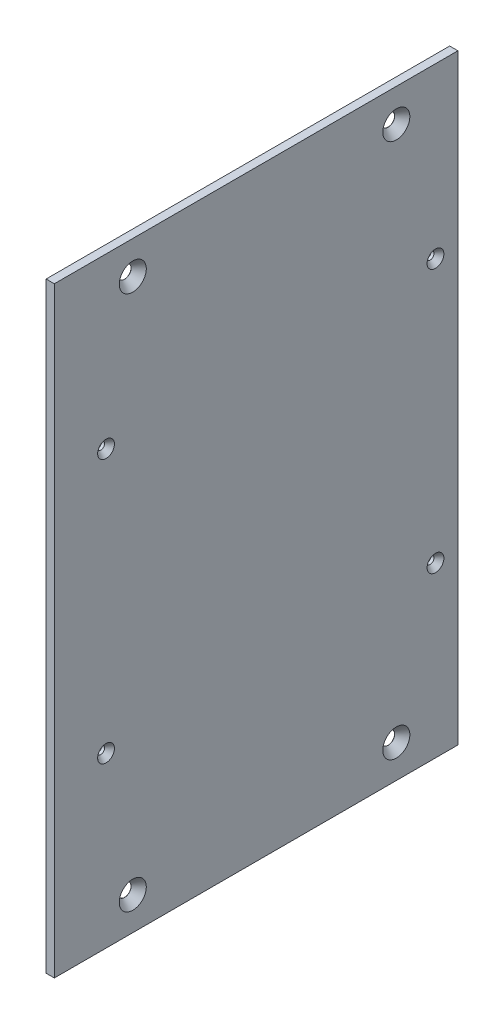
ISO-10303-21;
HEADER;
FILE_DESCRIPTION(('STEP AP214'),'2;1');
FILE_NAME('part.step','',(''),(''),'','','');
FILE_SCHEMA(('AUTOMOTIVE_DESIGN { 1 0 10303 214 1 1 1 1 }'));
ENDSEC;
DATA;
#1=APPLICATION_CONTEXT('core data for automotive mechanical design processes');
#2=APPLICATION_PROTOCOL_DEFINITION('international standard','automotive_design',2000,#1);
#3=PRODUCT_CONTEXT('',#1,'mechanical');
#4=PRODUCT('Part','Part','',(#3));
#5=PRODUCT_RELATED_PRODUCT_CATEGORY('part','',(#4));
#6=PRODUCT_DEFINITION_FORMATION('','',#4);
#7=PRODUCT_DEFINITION_CONTEXT('part definition',#1,'design');
#8=PRODUCT_DEFINITION('design','',#6,#7);
#9=PRODUCT_DEFINITION_SHAPE('','',#8);
#10=(LENGTH_UNIT() NAMED_UNIT(*) SI_UNIT(.MILLI.,.METRE.));
#11=(NAMED_UNIT(*) PLANE_ANGLE_UNIT() SI_UNIT($,.RADIAN.));
#12=(NAMED_UNIT(*) SI_UNIT($,.STERADIAN.) SOLID_ANGLE_UNIT());
#13=UNCERTAINTY_MEASURE_WITH_UNIT(LENGTH_MEASURE(1.E-05),#10,'distance_accuracy_value','');
#14=(GEOMETRIC_REPRESENTATION_CONTEXT(3) GLOBAL_UNCERTAINTY_ASSIGNED_CONTEXT((#13)) GLOBAL_UNIT_ASSIGNED_CONTEXT((#10,
#11,#12)) REPRESENTATION_CONTEXT('',''));
#15=CARTESIAN_POINT('',(0.,0.,0.));
#16=DIRECTION('',(0.,0.,1.));
#17=DIRECTION('',(1.,0.,0.));
#18=AXIS2_PLACEMENT_3D('',#15,#16,#17);
#19=CARTESIAN_POINT('',(22.225,24.3094717648979,25.2650178388084));
#20=DIRECTION('',(0.,-1.,0.));
#21=DIRECTION('',(1.,0.,0.));
#22=AXIS2_PLACEMENT_3D('',#19,#20,#21);
#23=PLANE('',#22);
#24=DIRECTION('',(0.,0.,1.));
#25=VECTOR('',#24,1.);
#26=CARTESIAN_POINT('',(19.05,24.3094717648979,25.2650178388084));
#27=LINE('',#26,#25);
#28=CARTESIAN_POINT('',(19.05,24.3094717648979,25.2650178388084));
#29=VERTEX_POINT('',#28);
#30=CARTESIAN_POINT('',(19.05,24.3094717648979,180.840017838808));
#31=VERTEX_POINT('',#30);
#32=EDGE_CURVE('E111',#29,#31,#27,.T.);
#33=ORIENTED_EDGE('',*,*,#32,.T.);
#34=DIRECTION('',(-1.,0.,0.));
#35=VECTOR('',#34,1.);
#36=CARTESIAN_POINT('',(22.225,24.3094717648979,180.840017838808));
#37=LINE('',#36,#35);
#38=CARTESIAN_POINT('',(22.225,24.3094717648979,180.840017838808));
#39=VERTEX_POINT('',#38);
#40=EDGE_CURVE('E11',#39,#31,#37,.T.);
#41=ORIENTED_EDGE('',*,*,#40,.F.);
#42=DIRECTION('',(0.,0.,1.));
#43=VECTOR('',#42,1.);
#44=CARTESIAN_POINT('',(22.225,24.3094717648979,25.2650178388084));
#45=LINE('',#44,#43);
#46=CARTESIAN_POINT('',(22.225,24.3094717648979,25.2650178388084));
#47=VERTEX_POINT('',#46);
#48=EDGE_CURVE('E95',#47,#39,#45,.T.);
#49=ORIENTED_EDGE('',*,*,#48,.F.);
#50=DIRECTION('',(-1.,0.,0.));
#51=VECTOR('',#50,1.);
#52=CARTESIAN_POINT('',(22.225,24.3094717648979,25.2650178388084));
#53=LINE('',#52,#51);
#54=EDGE_CURVE('E107',#47,#29,#53,.T.);
#55=ORIENTED_EDGE('',*,*,#54,.T.);
#56=EDGE_LOOP('',(#33,#41,#49,#55));
#57=FACE_BOUND('',#56,.T.);
#58=ADVANCED_FACE('F43',(#57),#23,.F.);
#59=CARTESIAN_POINT('',(22.225,24.3094717648979,180.840017838808));
#60=DIRECTION('',(0.,0.,-1.));
#61=DIRECTION('',(-1.,0.,0.));
#62=AXIS2_PLACEMENT_3D('',#59,#60,#61);
#63=PLANE('',#62);
#64=DIRECTION('',(0.,-1.,0.));
#65=VECTOR('',#64,1.);
#66=CARTESIAN_POINT('',(19.05,24.3094717648979,180.840017838808));
#67=LINE('',#66,#65);
#68=CARTESIAN_POINT('',(19.05,-207.465528738518,180.840017838808));
#69=VERTEX_POINT('',#68);
#70=EDGE_CURVE('E100',#31,#69,#67,.T.);
#71=ORIENTED_EDGE('',*,*,#70,.T.);
#72=DIRECTION('',(-1.,0.,0.));
#73=VECTOR('',#72,1.);
#74=CARTESIAN_POINT('',(22.225,-207.465528738518,180.840017838808));
#75=LINE('',#74,#73);
#76=CARTESIAN_POINT('',(22.225,-207.465528738518,180.840017838808));
#77=VERTEX_POINT('',#76);
#78=EDGE_CURVE('E52',#77,#69,#75,.T.);
#79=ORIENTED_EDGE('',*,*,#78,.F.);
#80=DIRECTION('',(0.,-1.,0.));
#81=VECTOR('',#80,1.);
#82=CARTESIAN_POINT('',(22.225,24.3094717648979,180.840017838808));
#83=LINE('',#82,#81);
#84=EDGE_CURVE('E90',#39,#77,#83,.T.);
#85=ORIENTED_EDGE('',*,*,#84,.F.);
#86=ORIENTED_EDGE('',*,*,#40,.T.);
#87=EDGE_LOOP('',(#71,#79,#85,#86));
#88=FACE_BOUND('',#87,.T.);
#89=ADVANCED_FACE('F99',(#88),#63,.F.);
#90=CARTESIAN_POINT('',(22.225,-207.465528738518,180.840017838808));
#91=DIRECTION('',(0.,1.,0.));
#92=DIRECTION('',(0.,0.,1.));
#93=AXIS2_PLACEMENT_3D('',#90,#91,#92);
#94=PLANE('',#93);
#95=DIRECTION('',(0.,0.,-1.));
#96=VECTOR('',#95,1.);
#97=CARTESIAN_POINT('',(19.05,-207.465528738518,180.840017838808));
#98=LINE('',#97,#96);
#99=CARTESIAN_POINT('',(19.05,-207.465528738517,25.2650178388084));
#100=VERTEX_POINT('',#99);
#101=EDGE_CURVE('E77',#69,#100,#98,.T.);
#102=ORIENTED_EDGE('',*,*,#101,.T.);
#103=DIRECTION('',(-1.,0.,0.));
#104=VECTOR('',#103,1.);
#105=CARTESIAN_POINT('',(22.225,-207.465528738517,25.2650178388084));
#106=LINE('',#105,#104);
#107=CARTESIAN_POINT('',(22.225,-207.465528738517,25.2650178388084));
#108=VERTEX_POINT('',#107);
#109=EDGE_CURVE('E102',#108,#100,#106,.T.);
#110=ORIENTED_EDGE('',*,*,#109,.F.);
#111=DIRECTION('',(0.,0.,-1.));
#112=VECTOR('',#111,1.);
#113=CARTESIAN_POINT('',(22.225,-207.465528738518,180.840017838808));
#114=LINE('',#113,#112);
#115=EDGE_CURVE('E93',#77,#108,#114,.T.);
#116=ORIENTED_EDGE('',*,*,#115,.F.);
#117=ORIENTED_EDGE('',*,*,#78,.T.);
#118=EDGE_LOOP('',(#102,#110,#116,#117));
#119=FACE_BOUND('',#118,.T.);
#120=ADVANCED_FACE('F103',(#119),#94,.F.);
#121=CARTESIAN_POINT('',(22.225,-207.465528738517,25.2650178388084));
#122=DIRECTION('',(0.,0.,1.));
#123=DIRECTION('',(1.,0.,0.));
#124=AXIS2_PLACEMENT_3D('',#121,#122,#123);
#125=PLANE('',#124);
#126=DIRECTION('',(0.,1.,0.));
#127=VECTOR('',#126,1.);
#128=CARTESIAN_POINT('',(19.05,-207.465528738517,25.2650178388084));
#129=LINE('',#128,#127);
#130=EDGE_CURVE('E83',#100,#29,#129,.T.);
#131=ORIENTED_EDGE('',*,*,#130,.T.);
#132=ORIENTED_EDGE('',*,*,#54,.F.);
#133=DIRECTION('',(0.,1.,0.));
#134=VECTOR('',#133,1.);
#135=CARTESIAN_POINT('',(22.225,-207.465528738517,25.2650178388084));
#136=LINE('',#135,#134);
#137=EDGE_CURVE('E60',#108,#47,#136,.T.);
#138=ORIENTED_EDGE('',*,*,#137,.F.);
#139=ORIENTED_EDGE('',*,*,#109,.T.);
#140=EDGE_LOOP('',(#131,#132,#138,#139));
#141=FACE_BOUND('',#140,.T.);
#142=ADVANCED_FACE('F125',(#141),#125,.F.);
#143=CARTESIAN_POINT('',(22.225,0.,0.));
#144=DIRECTION('',(1.,0.,0.));
#145=DIRECTION('',(0.,1.,0.));
#146=AXIS2_PLACEMENT_3D('',#143,#144,#145);
#147=PLANE('',#146);
#148=CARTESIAN_POINT('',(22.225,-40.778028486811,160.910543981646));
#149=DIRECTION('',(1.,0.,0.));
#150=DIRECTION('',(0.,0.,-1.));
#151=AXIS2_PLACEMENT_3D('',#148,#149,#150);
#152=CIRCLE('',#151,3.2385);
#153=CARTESIAN_POINT('',(22.225,-40.778028486811,157.672043981647));
#154=VERTEX_POINT('',#153);
#155=EDGE_CURVE('E223',#154,#154,#152,.T.);
#156=ORIENTED_EDGE('',*,*,#155,.F.);
#157=EDGE_LOOP('',(#156));
#158=FACE_BOUND('',#157,.T.);
#159=CARTESIAN_POINT('',(22.225,-142.378028486811,160.910543981646));
#160=DIRECTION('',(1.,0.,0.));
#161=DIRECTION('',(0.,0.,-1.));
#162=AXIS2_PLACEMENT_3D('',#159,#160,#161);
#163=CIRCLE('',#162,3.23850000000001);
#164=CARTESIAN_POINT('',(22.225,-142.378028486811,157.672043981647));
#165=VERTEX_POINT('',#164);
#166=EDGE_CURVE('E211',#165,#165,#163,.T.);
#167=ORIENTED_EDGE('',*,*,#166,.F.);
#168=EDGE_LOOP('',(#167));
#169=FACE_BOUND('',#168,.T.);
#170=CARTESIAN_POINT('',(22.225,-142.378028486811,33.9105439816469));
#171=DIRECTION('',(1.,0.,0.));
#172=DIRECTION('',(0.,0.,-1.));
#173=AXIS2_PLACEMENT_3D('',#170,#171,#172);
#174=CIRCLE('',#173,3.23850000000001);
#175=CARTESIAN_POINT('',(22.225,-142.378028486811,30.6720439816469));
#176=VERTEX_POINT('',#175);
#177=EDGE_CURVE('E199',#176,#176,#174,.T.);
#178=ORIENTED_EDGE('',*,*,#177,.F.);
#179=EDGE_LOOP('',(#178));
#180=FACE_BOUND('',#179,.T.);
#181=CARTESIAN_POINT('',(22.225,-40.778028486811,33.9105439816469));
#182=DIRECTION('',(1.,0.,0.));
#183=DIRECTION('',(0.,0.,-1.));
#184=AXIS2_PLACEMENT_3D('',#181,#182,#183);
#185=CIRCLE('',#184,3.2385);
#186=CARTESIAN_POINT('',(22.225,-40.778028486811,30.6720439816469));
#187=VERTEX_POINT('',#186);
#188=EDGE_CURVE('E187',#187,#187,#185,.T.);
#189=ORIENTED_EDGE('',*,*,#188,.F.);
#190=EDGE_LOOP('',(#189));
#191=FACE_BOUND('',#190,.T.);
#192=CARTESIAN_POINT('',(22.225,-194.765528770403,150.600645729071));
#193=DIRECTION('',(-1.,0.,0.));
#194=DIRECTION('',(0.,0.,1.));
#195=AXIS2_PLACEMENT_3D('',#192,#193,#194);
#196=CIRCLE('',#195,5.20699999999999);
#197=CARTESIAN_POINT('',(22.225,-194.765528770403,155.807645729071));
#198=VERTEX_POINT('',#197);
#199=EDGE_CURVE('E175',#198,#198,#196,.T.);
#200=ORIENTED_EDGE('',*,*,#199,.T.);
#201=EDGE_LOOP('',(#200));
#202=FACE_BOUND('',#201,.T.);
#203=CARTESIAN_POINT('',(22.225,-194.765528770403,49.0006457290708));
#204=DIRECTION('',(-1.,0.,0.));
#205=DIRECTION('',(0.,0.,1.));
#206=AXIS2_PLACEMENT_3D('',#203,#204,#205);
#207=CIRCLE('',#206,5.20699999999999);
#208=CARTESIAN_POINT('',(22.225,-194.765528770403,54.2076457290708));
#209=VERTEX_POINT('',#208);
#210=EDGE_CURVE('E163',#209,#209,#207,.T.);
#211=ORIENTED_EDGE('',*,*,#210,.T.);
#212=EDGE_LOOP('',(#211));
#213=FACE_BOUND('',#212,.T.);
#214=CARTESIAN_POINT('',(22.225,11.6094717648979,49.0006457290708));
#215=DIRECTION('',(-1.,0.,0.));
#216=DIRECTION('',(0.,0.,1.));
#217=AXIS2_PLACEMENT_3D('',#214,#215,#216);
#218=CIRCLE('',#217,5.207);
#219=CARTESIAN_POINT('',(22.225,11.6094717648979,54.2076457290708));
#220=VERTEX_POINT('',#219);
#221=EDGE_CURVE('E151',#220,#220,#218,.T.);
#222=ORIENTED_EDGE('',*,*,#221,.T.);
#223=EDGE_LOOP('',(#222));
#224=FACE_BOUND('',#223,.T.);
#225=CARTESIAN_POINT('',(22.225,11.6094717648979,150.600645729071));
#226=DIRECTION('',(-1.,0.,0.));
#227=DIRECTION('',(0.,0.,1.));
#228=AXIS2_PLACEMENT_3D('',#225,#226,#227);
#229=CIRCLE('',#228,5.207);
#230=CARTESIAN_POINT('',(22.225,11.6094717648979,155.807645729071));
#231=VERTEX_POINT('',#230);
#232=EDGE_CURVE('E139',#231,#231,#229,.T.);
#233=ORIENTED_EDGE('',*,*,#232,.T.);
#234=EDGE_LOOP('',(#233));
#235=FACE_BOUND('',#234,.T.);
#236=ORIENTED_EDGE('',*,*,#48,.T.);
#237=ORIENTED_EDGE('',*,*,#84,.T.);
#238=ORIENTED_EDGE('',*,*,#115,.T.);
#239=ORIENTED_EDGE('',*,*,#137,.T.);
#240=EDGE_LOOP('',(#236,#237,#238,#239));
#241=FACE_BOUND('',#240,.T.);
#242=ADVANCED_FACE('F91',(#158,#169,#180,#191,#202,#213,#224,#235,#241),#147,.T.);
#243=CARTESIAN_POINT('',(19.05,0.,0.));
#244=DIRECTION('',(1.,0.,0.));
#245=DIRECTION('',(0.,1.,0.));
#246=AXIS2_PLACEMENT_3D('',#243,#244,#245);
#247=PLANE('',#246);
#248=CARTESIAN_POINT('',(19.0499999999998,-40.778028486811,160.910543981646));
#249=DIRECTION('',(1.,0.,0.));
#250=DIRECTION('',(0.,0.,-1.));
#251=AXIS2_PLACEMENT_3D('',#248,#249,#250);
#252=CIRCLE('',#251,1.47319999999999);
#253=CARTESIAN_POINT('',(19.0499999999998,-40.778028486811,159.437343981647));
#254=VERTEX_POINT('',#253);
#255=EDGE_CURVE('E215',#254,#254,#252,.T.);
#256=ORIENTED_EDGE('',*,*,#255,.T.);
#257=EDGE_LOOP('',(#256));
#258=FACE_BOUND('',#257,.T.);
#259=CARTESIAN_POINT('',(19.0499999999998,-142.378028486811,160.910543981646));
#260=DIRECTION('',(1.,0.,0.));
#261=DIRECTION('',(0.,0.,-1.));
#262=AXIS2_PLACEMENT_3D('',#259,#260,#261);
#263=CIRCLE('',#262,1.47320000000001);
#264=CARTESIAN_POINT('',(19.0499999999998,-142.378028486811,159.437343981647));
#265=VERTEX_POINT('',#264);
#266=EDGE_CURVE('E203',#265,#265,#263,.T.);
#267=ORIENTED_EDGE('',*,*,#266,.T.);
#268=EDGE_LOOP('',(#267));
#269=FACE_BOUND('',#268,.T.);
#270=CARTESIAN_POINT('',(19.0499999999998,-142.378028486811,33.9105439816469));
#271=DIRECTION('',(1.,0.,0.));
#272=DIRECTION('',(0.,0.,-1.));
#273=AXIS2_PLACEMENT_3D('',#270,#271,#272);
#274=CIRCLE('',#273,1.47320000000001);
#275=CARTESIAN_POINT('',(19.0499999999998,-142.378028486811,32.4373439816469));
#276=VERTEX_POINT('',#275);
#277=EDGE_CURVE('E191',#276,#276,#274,.T.);
#278=ORIENTED_EDGE('',*,*,#277,.T.);
#279=EDGE_LOOP('',(#278));
#280=FACE_BOUND('',#279,.T.);
#281=CARTESIAN_POINT('',(19.0499999999998,-40.778028486811,33.9105439816469));
#282=DIRECTION('',(1.,0.,0.));
#283=DIRECTION('',(0.,0.,-1.));
#284=AXIS2_PLACEMENT_3D('',#281,#282,#283);
#285=CIRCLE('',#284,1.47319999999999);
#286=CARTESIAN_POINT('',(19.0499999999998,-40.778028486811,32.4373439816469));
#287=VERTEX_POINT('',#286);
#288=EDGE_CURVE('E179',#287,#287,#285,.T.);
#289=ORIENTED_EDGE('',*,*,#288,.T.);
#290=EDGE_LOOP('',(#289));
#291=FACE_BOUND('',#290,.T.);
#292=CARTESIAN_POINT('',(19.05,-194.765528770403,150.600645729071));
#293=DIRECTION('',(-1.,0.,0.));
#294=DIRECTION('',(0.,0.,1.));
#295=AXIS2_PLACEMENT_3D('',#292,#293,#294);
#296=CIRCLE('',#295,2.4892);
#297=CARTESIAN_POINT('',(19.05,-194.765528770403,153.089845729071));
#298=VERTEX_POINT('',#297);
#299=EDGE_CURVE('E171',#298,#298,#296,.T.);
#300=ORIENTED_EDGE('',*,*,#299,.F.);
#301=EDGE_LOOP('',(#300));
#302=FACE_BOUND('',#301,.T.);
#303=CARTESIAN_POINT('',(19.05,-194.765528770403,49.0006457290708));
#304=DIRECTION('',(-1.,0.,0.));
#305=DIRECTION('',(0.,0.,1.));
#306=AXIS2_PLACEMENT_3D('',#303,#304,#305);
#307=CIRCLE('',#306,2.4892);
#308=CARTESIAN_POINT('',(19.05,-194.765528770403,51.4898457290708));
#309=VERTEX_POINT('',#308);
#310=EDGE_CURVE('E159',#309,#309,#307,.T.);
#311=ORIENTED_EDGE('',*,*,#310,.F.);
#312=EDGE_LOOP('',(#311));
#313=FACE_BOUND('',#312,.T.);
#314=CARTESIAN_POINT('',(19.05,11.6094717648979,49.0006457290708));
#315=DIRECTION('',(-1.,0.,0.));
#316=DIRECTION('',(0.,0.,1.));
#317=AXIS2_PLACEMENT_3D('',#314,#315,#316);
#318=CIRCLE('',#317,2.48919999999999);
#319=CARTESIAN_POINT('',(19.05,11.6094717648979,51.4898457290707));
#320=VERTEX_POINT('',#319);
#321=EDGE_CURVE('E147',#320,#320,#318,.T.);
#322=ORIENTED_EDGE('',*,*,#321,.F.);
#323=EDGE_LOOP('',(#322));
#324=FACE_BOUND('',#323,.T.);
#325=CARTESIAN_POINT('',(19.05,11.6094717648979,150.600645729071));
#326=DIRECTION('',(-1.,0.,0.));
#327=DIRECTION('',(0.,0.,1.));
#328=AXIS2_PLACEMENT_3D('',#325,#326,#327);
#329=CIRCLE('',#328,2.48919999999999);
#330=CARTESIAN_POINT('',(19.05,11.6094717648979,153.089845729071));
#331=VERTEX_POINT('',#330);
#332=EDGE_CURVE('E135',#331,#331,#329,.T.);
#333=ORIENTED_EDGE('',*,*,#332,.F.);
#334=EDGE_LOOP('',(#333));
#335=FACE_BOUND('',#334,.T.);
#336=ORIENTED_EDGE('',*,*,#32,.F.);
#337=ORIENTED_EDGE('',*,*,#130,.F.);
#338=ORIENTED_EDGE('',*,*,#101,.F.);
#339=ORIENTED_EDGE('',*,*,#70,.F.);
#340=EDGE_LOOP('',(#336,#337,#338,#339));
#341=FACE_BOUND('',#340,.T.);
#342=ADVANCED_FACE('F128',(#258,#269,#280,#291,#302,#313,#324,#335,#341),#247,.F.);
#343=CARTESIAN_POINT('',(19.0985287428547,11.6094717648979,150.600645729071));
#344=DIRECTION('',(1.,0.,0.));
#345=DIRECTION('',(0.,0.,-1.));
#346=AXIS2_PLACEMENT_3D('',#343,#344,#345);
#347=CONICAL_SURFACE('',#346,2.4892,0.715584993317674);
#348=ORIENTED_EDGE('',*,*,#232,.F.);
#349=EDGE_LOOP('',(#348));
#350=FACE_BOUND('',#349,.T.);
#351=CARTESIAN_POINT('',(19.0985287428547,11.6094717648979,150.600645729071));
#352=DIRECTION('',(-1.,0.,0.));
#353=DIRECTION('',(0.,0.,1.));
#354=AXIS2_PLACEMENT_3D('',#351,#352,#353);
#355=CIRCLE('',#354,2.4892);
#356=CARTESIAN_POINT('',(19.0985287428547,11.6094717648979,153.089845729071));
#357=VERTEX_POINT('',#356);
#358=EDGE_CURVE('E115',#357,#357,#355,.T.);
#359=ORIENTED_EDGE('',*,*,#358,.T.);
#360=EDGE_LOOP('',(#359));
#361=FACE_BOUND('',#360,.T.);
#362=ADVANCED_FACE('F247',(#350,#361),#347,.F.);
#363=CARTESIAN_POINT('',(19.05,11.6094717648979,150.600645729071));
#364=DIRECTION('',(-1.,0.,0.));
#365=DIRECTION('',(0.,0.,1.));
#366=AXIS2_PLACEMENT_3D('',#363,#364,#365);
#367=CYLINDRICAL_SURFACE('',#366,2.48919999999999);
#368=ORIENTED_EDGE('',*,*,#358,.F.);
#369=EDGE_LOOP('',(#368));
#370=FACE_BOUND('',#369,.T.);
#371=ORIENTED_EDGE('',*,*,#332,.T.);
#372=EDGE_LOOP('',(#371));
#373=FACE_BOUND('',#372,.T.);
#374=ADVANCED_FACE('F250',(#370,#373),#367,.F.);
#375=CARTESIAN_POINT('',(19.0985287428547,11.6094717648979,49.0006457290708));
#376=DIRECTION('',(1.,0.,0.));
#377=DIRECTION('',(0.,0.,-1.));
#378=AXIS2_PLACEMENT_3D('',#375,#376,#377);
#379=CONICAL_SURFACE('',#378,2.4892,0.715584993317674);
#380=ORIENTED_EDGE('',*,*,#221,.F.);
#381=EDGE_LOOP('',(#380));
#382=FACE_BOUND('',#381,.T.);
#383=CARTESIAN_POINT('',(19.0985287428547,11.6094717648979,49.0006457290708));
#384=DIRECTION('',(-1.,0.,0.));
#385=DIRECTION('',(0.,0.,1.));
#386=AXIS2_PLACEMENT_3D('',#383,#384,#385);
#387=CIRCLE('',#386,2.4892);
#388=CARTESIAN_POINT('',(19.0985287428547,11.6094717648979,51.4898457290708));
#389=VERTEX_POINT('',#388);
#390=EDGE_CURVE('E143',#389,#389,#387,.T.);
#391=ORIENTED_EDGE('',*,*,#390,.T.);
#392=EDGE_LOOP('',(#391));
#393=FACE_BOUND('',#392,.T.);
#394=ADVANCED_FACE('F256',(#382,#393),#379,.F.);
#395=CARTESIAN_POINT('',(19.05,11.6094717648979,49.0006457290708));
#396=DIRECTION('',(-1.,0.,0.));
#397=DIRECTION('',(0.,0.,1.));
#398=AXIS2_PLACEMENT_3D('',#395,#396,#397);
#399=CYLINDRICAL_SURFACE('',#398,2.48919999999999);
#400=ORIENTED_EDGE('',*,*,#390,.F.);
#401=EDGE_LOOP('',(#400));
#402=FACE_BOUND('',#401,.T.);
#403=ORIENTED_EDGE('',*,*,#321,.T.);
#404=EDGE_LOOP('',(#403));
#405=FACE_BOUND('',#404,.T.);
#406=ADVANCED_FACE('F428',(#402,#405),#399,.F.);
#407=CARTESIAN_POINT('',(19.0985287428547,-194.765528770403,49.0006457290708));
#408=DIRECTION('',(1.,0.,0.));
#409=DIRECTION('',(0.,0.,-1.));
#410=AXIS2_PLACEMENT_3D('',#407,#408,#409);
#411=CONICAL_SURFACE('',#410,2.4892,0.715584993317672);
#412=ORIENTED_EDGE('',*,*,#210,.F.);
#413=EDGE_LOOP('',(#412));
#414=FACE_BOUND('',#413,.T.);
#415=CARTESIAN_POINT('',(19.0985287428547,-194.765528770403,49.0006457290708));
#416=DIRECTION('',(-1.,0.,0.));
#417=DIRECTION('',(0.,0.,1.));
#418=AXIS2_PLACEMENT_3D('',#415,#416,#417);
#419=CIRCLE('',#418,2.4892);
#420=CARTESIAN_POINT('',(19.0985287428547,-194.765528770403,51.4898457290708));
#421=VERTEX_POINT('',#420);
#422=EDGE_CURVE('E155',#421,#421,#419,.T.);
#423=ORIENTED_EDGE('',*,*,#422,.T.);
#424=EDGE_LOOP('',(#423));
#425=FACE_BOUND('',#424,.T.);
#426=ADVANCED_FACE('F418',(#414,#425),#411,.F.);
#427=CARTESIAN_POINT('',(19.05,-194.765528770403,49.0006457290708));
#428=DIRECTION('',(-1.,0.,0.));
#429=DIRECTION('',(0.,0.,1.));
#430=AXIS2_PLACEMENT_3D('',#427,#428,#429);
#431=CYLINDRICAL_SURFACE('',#430,2.4892);
#432=ORIENTED_EDGE('',*,*,#422,.F.);
#433=EDGE_LOOP('',(#432));
#434=FACE_BOUND('',#433,.T.);
#435=ORIENTED_EDGE('',*,*,#310,.T.);
#436=EDGE_LOOP('',(#435));
#437=FACE_BOUND('',#436,.T.);
#438=ADVANCED_FACE('F409',(#434,#437),#431,.F.);
#439=CARTESIAN_POINT('',(19.0985287428547,-194.765528770403,150.600645729071));
#440=DIRECTION('',(1.,0.,0.));
#441=DIRECTION('',(0.,0.,-1.));
#442=AXIS2_PLACEMENT_3D('',#439,#440,#441);
#443=CONICAL_SURFACE('',#442,2.4892,0.715584993317672);
#444=ORIENTED_EDGE('',*,*,#199,.F.);
#445=EDGE_LOOP('',(#444));
#446=FACE_BOUND('',#445,.T.);
#447=CARTESIAN_POINT('',(19.0985287428547,-194.765528770403,150.600645729071));
#448=DIRECTION('',(-1.,0.,0.));
#449=DIRECTION('',(0.,0.,1.));
#450=AXIS2_PLACEMENT_3D('',#447,#448,#449);
#451=CIRCLE('',#450,2.4892);
#452=CARTESIAN_POINT('',(19.0985287428547,-194.765528770403,153.089845729071));
#453=VERTEX_POINT('',#452);
#454=EDGE_CURVE('E167',#453,#453,#451,.T.);
#455=ORIENTED_EDGE('',*,*,#454,.T.);
#456=EDGE_LOOP('',(#455));
#457=FACE_BOUND('',#456,.T.);
#458=ADVANCED_FACE('F400',(#446,#457),#443,.F.);
#459=CARTESIAN_POINT('',(19.05,-194.765528770403,150.600645729071));
#460=DIRECTION('',(-1.,0.,0.));
#461=DIRECTION('',(0.,0.,1.));
#462=AXIS2_PLACEMENT_3D('',#459,#460,#461);
#463=CYLINDRICAL_SURFACE('',#462,2.4892);
#464=ORIENTED_EDGE('',*,*,#454,.F.);
#465=EDGE_LOOP('',(#464));
#466=FACE_BOUND('',#465,.T.);
#467=ORIENTED_EDGE('',*,*,#299,.T.);
#468=EDGE_LOOP('',(#467));
#469=FACE_BOUND('',#468,.T.);
#470=ADVANCED_FACE('F292',(#466,#469),#463,.F.);
#471=CARTESIAN_POINT('',(22.225,-40.778028486811,33.9105439816469));
#472=DIRECTION('',(1.,0.,0.));
#473=DIRECTION('',(0.,0.,-1.));
#474=AXIS2_PLACEMENT_3D('',#471,#472,#473);
#475=CYLINDRICAL_SURFACE('',#474,1.47319999999999);
#476=ORIENTED_EDGE('',*,*,#288,.F.);
#477=EDGE_LOOP('',(#476));
#478=FACE_BOUND('',#477,.T.);
#479=CARTESIAN_POINT('',(20.1942546507328,-40.778028486811,33.9105439816469));
#480=DIRECTION('',(1.,0.,0.));
#481=DIRECTION('',(0.,0.,-1.));
#482=AXIS2_PLACEMENT_3D('',#479,#480,#481);
#483=CIRCLE('',#482,1.47319999999999);
#484=CARTESIAN_POINT('',(20.1942546507328,-40.778028486811,32.4373439816469));
#485=VERTEX_POINT('',#484);
#486=EDGE_CURVE('E183',#485,#485,#483,.T.);
#487=ORIENTED_EDGE('',*,*,#486,.T.);
#488=EDGE_LOOP('',(#487));
#489=FACE_BOUND('',#488,.T.);
#490=ADVANCED_FACE('F303',(#478,#489),#475,.F.);
#491=CARTESIAN_POINT('',(22.225,-40.778028486811,33.9105439816469));
#492=DIRECTION('',(1.,0.,0.));
#493=DIRECTION('',(0.,0.,-1.));
#494=AXIS2_PLACEMENT_3D('',#491,#492,#493);
#495=CONICAL_SURFACE('',#494,3.2385,0.715584993317677);
#496=ORIENTED_EDGE('',*,*,#486,.F.);
#497=EDGE_LOOP('',(#496));
#498=FACE_BOUND('',#497,.T.);
#499=ORIENTED_EDGE('',*,*,#188,.T.);
#500=EDGE_LOOP('',(#499));
#501=FACE_BOUND('',#500,.T.);
#502=ADVANCED_FACE('F308',(#498,#501),#495,.F.);
#503=CARTESIAN_POINT('',(22.225,-142.378028486811,33.9105439816469));
#504=DIRECTION('',(1.,0.,0.));
#505=DIRECTION('',(0.,0.,-1.));
#506=AXIS2_PLACEMENT_3D('',#503,#504,#505);
#507=CYLINDRICAL_SURFACE('',#506,1.47320000000001);
#508=ORIENTED_EDGE('',*,*,#277,.F.);
#509=EDGE_LOOP('',(#508));
#510=FACE_BOUND('',#509,.T.);
#511=CARTESIAN_POINT('',(20.1942546507328,-142.378028486811,33.9105439816469));
#512=DIRECTION('',(1.,0.,0.));
#513=DIRECTION('',(0.,0.,-1.));
#514=AXIS2_PLACEMENT_3D('',#511,#512,#513);
#515=CIRCLE('',#514,1.47320000000001);
#516=CARTESIAN_POINT('',(20.1942546507328,-142.378028486811,32.4373439816469));
#517=VERTEX_POINT('',#516);
#518=EDGE_CURVE('E195',#517,#517,#515,.T.);
#519=ORIENTED_EDGE('',*,*,#518,.T.);
#520=EDGE_LOOP('',(#519));
#521=FACE_BOUND('',#520,.T.);
#522=ADVANCED_FACE('F319',(#510,#521),#507,.F.);
#523=CARTESIAN_POINT('',(22.225,-142.378028486811,33.9105439816469));
#524=DIRECTION('',(1.,0.,0.));
#525=DIRECTION('',(0.,0.,-1.));
#526=AXIS2_PLACEMENT_3D('',#523,#524,#525);
#527=CONICAL_SURFACE('',#526,3.23850000000001,0.715584993317675);
#528=ORIENTED_EDGE('',*,*,#518,.F.);
#529=EDGE_LOOP('',(#528));
#530=FACE_BOUND('',#529,.T.);
#531=ORIENTED_EDGE('',*,*,#177,.T.);
#532=EDGE_LOOP('',(#531));
#533=FACE_BOUND('',#532,.T.);
#534=ADVANCED_FACE('F330',(#530,#533),#527,.F.);
#535=CARTESIAN_POINT('',(22.225,-142.378028486811,160.910543981646));
#536=DIRECTION('',(1.,0.,0.));
#537=DIRECTION('',(0.,0.,-1.));
#538=AXIS2_PLACEMENT_3D('',#535,#536,#537);
#539=CYLINDRICAL_SURFACE('',#538,1.47320000000001);
#540=ORIENTED_EDGE('',*,*,#266,.F.);
#541=EDGE_LOOP('',(#540));
#542=FACE_BOUND('',#541,.T.);
#543=CARTESIAN_POINT('',(20.1942546507328,-142.378028486811,160.910543981646));
#544=DIRECTION('',(1.,0.,0.));
#545=DIRECTION('',(0.,0.,-1.));
#546=AXIS2_PLACEMENT_3D('',#543,#544,#545);
#547=CIRCLE('',#546,1.47320000000001);
#548=CARTESIAN_POINT('',(20.1942546507328,-142.378028486811,159.437343981647));
#549=VERTEX_POINT('',#548);
#550=EDGE_CURVE('E207',#549,#549,#547,.T.);
#551=ORIENTED_EDGE('',*,*,#550,.T.);
#552=EDGE_LOOP('',(#551));
#553=FACE_BOUND('',#552,.T.);
#554=ADVANCED_FACE('F341',(#542,#553),#539,.F.);
#555=CARTESIAN_POINT('',(22.225,-142.378028486811,160.910543981646));
#556=DIRECTION('',(1.,0.,0.));
#557=DIRECTION('',(0.,0.,-1.));
#558=AXIS2_PLACEMENT_3D('',#555,#556,#557);
#559=CONICAL_SURFACE('',#558,3.23850000000001,0.715584993317675);
#560=ORIENTED_EDGE('',*,*,#550,.F.);
#561=EDGE_LOOP('',(#560));
#562=FACE_BOUND('',#561,.T.);
#563=ORIENTED_EDGE('',*,*,#166,.T.);
#564=EDGE_LOOP('',(#563));
#565=FACE_BOUND('',#564,.T.);
#566=ADVANCED_FACE('F352',(#562,#565),#559,.F.);
#567=CARTESIAN_POINT('',(22.225,-40.778028486811,160.910543981646));
#568=DIRECTION('',(1.,0.,0.));
#569=DIRECTION('',(0.,0.,-1.));
#570=AXIS2_PLACEMENT_3D('',#567,#568,#569);
#571=CYLINDRICAL_SURFACE('',#570,1.47319999999999);
#572=ORIENTED_EDGE('',*,*,#255,.F.);
#573=EDGE_LOOP('',(#572));
#574=FACE_BOUND('',#573,.T.);
#575=CARTESIAN_POINT('',(20.1942546507328,-40.778028486811,160.910543981646));
#576=DIRECTION('',(1.,0.,0.));
#577=DIRECTION('',(0.,0.,-1.));
#578=AXIS2_PLACEMENT_3D('',#575,#576,#577);
#579=CIRCLE('',#578,1.47319999999999);
#580=CARTESIAN_POINT('',(20.1942546507328,-40.778028486811,159.437343981647));
#581=VERTEX_POINT('',#580);
#582=EDGE_CURVE('E219',#581,#581,#579,.T.);
#583=ORIENTED_EDGE('',*,*,#582,.T.);
#584=EDGE_LOOP('',(#583));
#585=FACE_BOUND('',#584,.T.);
#586=ADVANCED_FACE('F363',(#574,#585),#571,.F.);
#587=CARTESIAN_POINT('',(22.225,-40.778028486811,160.910543981646));
#588=DIRECTION('',(1.,0.,0.));
#589=DIRECTION('',(0.,0.,-1.));
#590=AXIS2_PLACEMENT_3D('',#587,#588,#589);
#591=CONICAL_SURFACE('',#590,3.2385,0.715584993317677);
#592=ORIENTED_EDGE('',*,*,#582,.F.);
#593=EDGE_LOOP('',(#592));
#594=FACE_BOUND('',#593,.T.);
#595=ORIENTED_EDGE('',*,*,#155,.T.);
#596=EDGE_LOOP('',(#595));
#597=FACE_BOUND('',#596,.T.);
#598=ADVANCED_FACE('F228',(#594,#597),#591,.F.);
#599=CLOSED_SHELL('',(#58,#89,#120,#142,#242,#342,#362,#374,#394,#406,#426,#438,#458,#470,#490,
#502,#522,#534,#554,#566,#586,#598));
#600=MANIFOLD_SOLID_BREP('B2',#599);
#601=ADVANCED_BREP_SHAPE_REPRESENTATION('',(#18,#600),#14);
#602=SHAPE_DEFINITION_REPRESENTATION(#9,#601);
ENDSEC;
END-ISO-10303-21;
